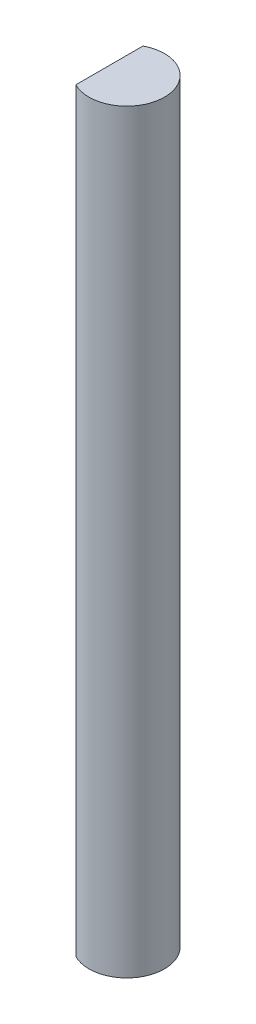
ISO-10303-21;
HEADER;
FILE_DESCRIPTION(('STEP AP214'),'2;1');
FILE_NAME('part.step','',(''),(''),'','','');
FILE_SCHEMA(('AUTOMOTIVE_DESIGN { 1 0 10303 214 1 1 1 1 }'));
ENDSEC;
DATA;
#1=APPLICATION_CONTEXT('core data for automotive mechanical design processes');
#2=APPLICATION_PROTOCOL_DEFINITION('international standard','automotive_design',2000,#1);
#3=PRODUCT_CONTEXT('',#1,'mechanical');
#4=PRODUCT('Part','Part','',(#3));
#5=PRODUCT_RELATED_PRODUCT_CATEGORY('part','',(#4));
#6=PRODUCT_DEFINITION_FORMATION('','',#4);
#7=PRODUCT_DEFINITION_CONTEXT('part definition',#1,'design');
#8=PRODUCT_DEFINITION('design','',#6,#7);
#9=PRODUCT_DEFINITION_SHAPE('','',#8);
#10=(LENGTH_UNIT() NAMED_UNIT(*) SI_UNIT(.MILLI.,.METRE.));
#11=(NAMED_UNIT(*) PLANE_ANGLE_UNIT() SI_UNIT($,.RADIAN.));
#12=(NAMED_UNIT(*) SI_UNIT($,.STERADIAN.) SOLID_ANGLE_UNIT());
#13=UNCERTAINTY_MEASURE_WITH_UNIT(LENGTH_MEASURE(1.E-05),#10,'distance_accuracy_value','');
#14=(GEOMETRIC_REPRESENTATION_CONTEXT(3) GLOBAL_UNCERTAINTY_ASSIGNED_CONTEXT((#13)) GLOBAL_UNIT_ASSIGNED_CONTEXT((#10,
#11,#12)) REPRESENTATION_CONTEXT('',''));
#15=CARTESIAN_POINT('',(0.,0.,0.));
#16=DIRECTION('',(0.,0.,1.));
#17=DIRECTION('',(1.,0.,0.));
#18=AXIS2_PLACEMENT_3D('',#15,#16,#17);
#19=CARTESIAN_POINT('',(-4.51605117565421,76.2,0.));
#20=DIRECTION('',(1.,0.,0.));
#21=DIRECTION('',(0.,0.,-1.));
#22=AXIS2_PLACEMENT_3D('',#19,#20,#21);
#23=PLANE('',#22);
#24=DIRECTION('',(0.,0.,1.));
#25=VECTOR('',#24,1.);
#26=CARTESIAN_POINT('',(-4.51605117565421,0.,0.));
#27=LINE('',#26,#25);
#28=CARTESIAN_POINT('',(-4.51605117565421,0.,-3.38625322997262));
#29=VERTEX_POINT('',#28);
#30=CARTESIAN_POINT('',(-4.51605117565421,0.,3.38625322997262));
#31=VERTEX_POINT('',#30);
#32=EDGE_CURVE('E69',#29,#31,#27,.T.);
#33=ORIENTED_EDGE('',*,*,#32,.T.);
#34=DIRECTION('',(0.,-1.,0.));
#35=VECTOR('',#34,1.);
#36=CARTESIAN_POINT('',(-4.51605117565421,76.2,3.38625322997262));
#37=LINE('',#36,#35);
#38=CARTESIAN_POINT('',(-4.51605117565421,76.2,3.38625322997262));
#39=VERTEX_POINT('',#38);
#40=EDGE_CURVE('E11',#39,#31,#37,.T.);
#41=ORIENTED_EDGE('',*,*,#40,.F.);
#42=DIRECTION('',(0.,0.,1.));
#43=VECTOR('',#42,1.);
#44=CARTESIAN_POINT('',(-4.51605117565421,76.2,0.));
#45=LINE('',#44,#43);
#46=CARTESIAN_POINT('',(-4.51605117565421,76.2,-3.38625322997262));
#47=VERTEX_POINT('',#46);
#48=EDGE_CURVE('E68',#47,#39,#45,.T.);
#49=ORIENTED_EDGE('',*,*,#48,.F.);
#50=DIRECTION('',(0.,-1.,0.));
#51=VECTOR('',#50,1.);
#52=CARTESIAN_POINT('',(-4.51605117565421,76.2,-3.38625322997262));
#53=LINE('',#52,#51);
#54=EDGE_CURVE('E46',#47,#29,#53,.T.);
#55=ORIENTED_EDGE('',*,*,#54,.T.);
#56=EDGE_LOOP('',(#33,#41,#49,#55));
#57=FACE_BOUND('',#56,.T.);
#58=ADVANCED_FACE('F38',(#57),#23,.F.);
#59=CARTESIAN_POINT('',(-2.76980117565421,76.2,0.));
#60=DIRECTION('',(0.,-1.,0.));
#61=DIRECTION('',(0.,0.,-1.));
#62=AXIS2_PLACEMENT_3D('',#59,#60,#61);
#63=CYLINDRICAL_SURFACE('',#62,3.81);
#64=CARTESIAN_POINT('',(-2.76980117565421,0.,0.));
#65=DIRECTION('',(0.,1.,0.));
#66=DIRECTION('',(0.,0.,1.));
#67=AXIS2_PLACEMENT_3D('',#64,#65,#66);
#68=CIRCLE('',#67,3.81);
#69=EDGE_CURVE('E61',#31,#29,#68,.T.);
#70=ORIENTED_EDGE('',*,*,#69,.T.);
#71=ORIENTED_EDGE('',*,*,#54,.F.);
#72=CARTESIAN_POINT('',(-2.76980117565421,76.2,0.));
#73=DIRECTION('',(0.,1.,0.));
#74=DIRECTION('',(0.,0.,1.));
#75=AXIS2_PLACEMENT_3D('',#72,#73,#74);
#76=CIRCLE('',#75,3.81);
#77=EDGE_CURVE('E53',#39,#47,#76,.T.);
#78=ORIENTED_EDGE('',*,*,#77,.F.);
#79=ORIENTED_EDGE('',*,*,#40,.T.);
#80=EDGE_LOOP('',(#70,#71,#78,#79));
#81=FACE_BOUND('',#80,.T.);
#82=ADVANCED_FACE('F64',(#81),#63,.T.);
#83=CARTESIAN_POINT('',(0.,76.2,0.));
#84=DIRECTION('',(0.,1.,0.));
#85=DIRECTION('',(0.,0.,1.));
#86=AXIS2_PLACEMENT_3D('',#83,#84,#85);
#87=PLANE('',#86);
#88=ORIENTED_EDGE('',*,*,#48,.T.);
#89=ORIENTED_EDGE('',*,*,#77,.T.);
#90=EDGE_LOOP('',(#88,#89));
#91=FACE_BOUND('',#90,.T.);
#92=ADVANCED_FACE('F76',(#91),#87,.T.);
#93=CARTESIAN_POINT('',(0.,0.,0.));
#94=DIRECTION('',(0.,1.,0.));
#95=DIRECTION('',(0.,0.,1.));
#96=AXIS2_PLACEMENT_3D('',#93,#94,#95);
#97=PLANE('',#96);
#98=ORIENTED_EDGE('',*,*,#32,.F.);
#99=ORIENTED_EDGE('',*,*,#69,.F.);
#100=EDGE_LOOP('',(#98,#99));
#101=FACE_BOUND('',#100,.T.);
#102=ADVANCED_FACE('F72',(#101),#97,.F.);
#103=CLOSED_SHELL('',(#58,#82,#92,#102));
#104=MANIFOLD_SOLID_BREP('B2',#103);
#105=ADVANCED_BREP_SHAPE_REPRESENTATION('',(#18,#104),#14);
#106=SHAPE_DEFINITION_REPRESENTATION(#9,#105);
ENDSEC;
END-ISO-10303-21;
